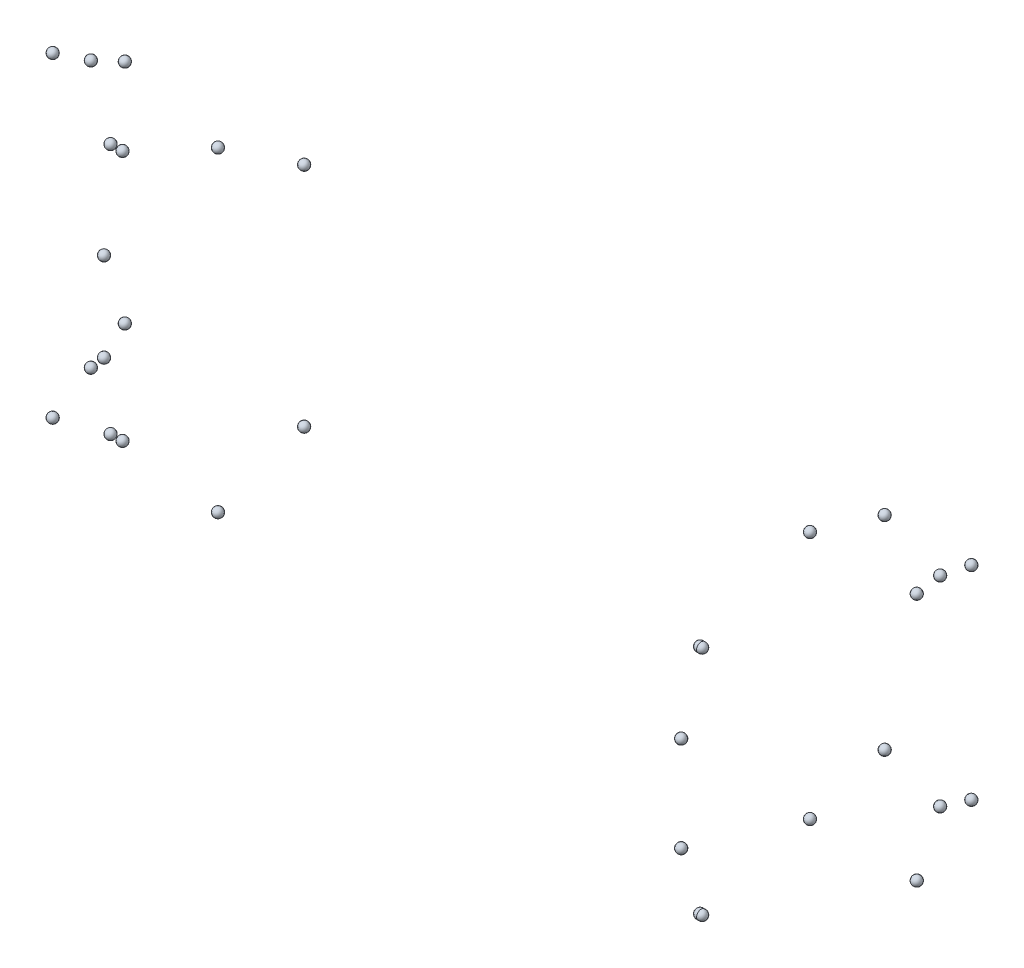
ISO-10303-21;
HEADER;
FILE_DESCRIPTION(('STEP AP214'),'2;1');
FILE_NAME('part.step','',(''),(''),'','','');
FILE_SCHEMA(('AUTOMOTIVE_DESIGN { 1 0 10303 214 1 1 1 1 }'));
ENDSEC;
DATA;
#1=APPLICATION_CONTEXT('core data for automotive mechanical design processes');
#2=APPLICATION_PROTOCOL_DEFINITION('international standard','automotive_design',2000,#1);
#3=PRODUCT_CONTEXT('',#1,'mechanical');
#4=PRODUCT('Part','Part','',(#3));
#5=PRODUCT_RELATED_PRODUCT_CATEGORY('part','',(#4));
#6=PRODUCT_DEFINITION_FORMATION('','',#4);
#7=PRODUCT_DEFINITION_CONTEXT('part definition',#1,'design');
#8=PRODUCT_DEFINITION('design','',#6,#7);
#9=PRODUCT_DEFINITION_SHAPE('','',#8);
#10=(LENGTH_UNIT() NAMED_UNIT(*) SI_UNIT(.MILLI.,.METRE.));
#11=(NAMED_UNIT(*) PLANE_ANGLE_UNIT() SI_UNIT($,.RADIAN.));
#12=(NAMED_UNIT(*) SI_UNIT($,.STERADIAN.) SOLID_ANGLE_UNIT());
#13=UNCERTAINTY_MEASURE_WITH_UNIT(LENGTH_MEASURE(1.E-05),#10,'distance_accuracy_value','');
#14=(GEOMETRIC_REPRESENTATION_CONTEXT(3) GLOBAL_UNCERTAINTY_ASSIGNED_CONTEXT((#13)) GLOBAL_UNIT_ASSIGNED_CONTEXT((#10,
#11,#12)) REPRESENTATION_CONTEXT('',''));
#15=CARTESIAN_POINT('',(0.,0.,0.));
#16=DIRECTION('',(0.,0.,1.));
#17=DIRECTION('',(1.,0.,0.));
#18=AXIS2_PLACEMENT_3D('',#15,#16,#17);
#19=CARTESIAN_POINT('',(3.83885720915255,100.814094182891,618.081416146198));
#20=DIRECTION('',(0.,-1.,0.));
#21=DIRECTION('',(-1.,0.,0.));
#22=AXIS2_PLACEMENT_3D('',#19,#20,#21);
#23=SPHERICAL_SURFACE('',#22,10.);
#24=CARTESIAN_POINT('',(3.83885720915255,90.814094182891,618.081416146198));
#25=VERTEX_POINT('',#24);
#26=VERTEX_LOOP('',#25);
#27=FACE_BOUND('',#26,.T.);
#28=ADVANCED_FACE('P0_F13',(#27),#23,.T.);
#29=CLOSED_SHELL('',(#28));
#30=MANIFOLD_SOLID_BREP('P0_B1',#29);
#31=CARTESIAN_POINT('',(-1504.87722611713,94.0930005745882,335.429980441855));
#32=DIRECTION('',(0.,-1.,0.));
#33=DIRECTION('',(-1.,0.,0.));
#34=AXIS2_PLACEMENT_3D('',#31,#32,#33);
#35=SPHERICAL_SURFACE('',#34,10.);
#36=CARTESIAN_POINT('',(-1504.87722611713,84.0930005745882,335.429980441855));
#37=VERTEX_POINT('',#36);
#38=VERTEX_LOOP('',#37);
#39=FACE_BOUND('',#38,.T.);
#40=ADVANCED_FACE('P1_F13',(#39),#35,.T.);
#41=CLOSED_SHELL('',(#40));
#42=MANIFOLD_SOLID_BREP('P1_B1',#41);
#43=CARTESIAN_POINT('',(3.83885720915255,-100.814094182891,618.081416146198));
#44=DIRECTION('',(0.,-1.,0.));
#45=DIRECTION('',(-1.,0.,0.));
#46=AXIS2_PLACEMENT_3D('',#43,#44,#45);
#47=SPHERICAL_SURFACE('',#46,10.);
#48=CARTESIAN_POINT('',(3.83885720915255,-110.814094182891,618.081416146198));
#49=VERTEX_POINT('',#48);
#50=VERTEX_LOOP('',#49);
#51=FACE_BOUND('',#50,.T.);
#52=ADVANCED_FACE('P2_F13',(#51),#47,.T.);
#53=CLOSED_SHELL('',(#52));
#54=MANIFOLD_SOLID_BREP('P2_B1',#53);
#55=CARTESIAN_POINT('',(-1504.87722611713,-94.0930005745882,335.429980441855));
#56=DIRECTION('',(0.,-1.,0.));
#57=DIRECTION('',(-1.,0.,0.));
#58=AXIS2_PLACEMENT_3D('',#55,#56,#57);
#59=SPHERICAL_SURFACE('',#58,10.);
#60=CARTESIAN_POINT('',(-1504.87722611713,-104.093000574588,335.429980441855));
#61=VERTEX_POINT('',#60);
#62=VERTEX_LOOP('',#61);
#63=FACE_BOUND('',#62,.T.);
#64=ADVANCED_FACE('P3_F13',(#63),#59,.T.);
#65=CLOSED_SHELL('',(#64));
#66=MANIFOLD_SOLID_BREP('P3_B1',#65);
#67=CARTESIAN_POINT('',(-76.2,215.89999936,105.8672));
#68=DIRECTION('',(0.,-1.,0.));
#69=DIRECTION('',(-1.,0.,0.));
#70=AXIS2_PLACEMENT_3D('',#67,#68,#69);
#71=SPHERICAL_SURFACE('',#70,10.);
#72=CARTESIAN_POINT('',(-76.2,205.89999936,105.8672));
#73=VERTEX_POINT('',#72);
#74=VERTEX_LOOP('',#73);
#75=FACE_BOUND('',#74,.T.);
#76=ADVANCED_FACE('P4_F13',(#75),#71,.T.);
#77=CLOSED_SHELL('',(#76));
#78=MANIFOLD_SOLID_BREP('P4_B1',#77);
#79=CARTESIAN_POINT('',(-1692.39896034035,240.901803153981,103.647283415333));
#80=DIRECTION('',(0.,-1.,0.));
#81=DIRECTION('',(-1.,0.,0.));
#82=AXIS2_PLACEMENT_3D('',#79,#80,#81);
#83=SPHERICAL_SURFACE('',#82,10.);
#84=CARTESIAN_POINT('',(-1692.39896034035,230.901803153981,103.647283415333));
#85=VERTEX_POINT('',#84);
#86=VERTEX_LOOP('',#85);
#87=FACE_BOUND('',#86,.T.);
#88=ADVANCED_FACE('P5_F13',(#87),#83,.T.);
#89=CLOSED_SHELL('',(#88));
#90=MANIFOLD_SOLID_BREP('P5_B1',#89);
#91=CARTESIAN_POINT('',(-76.2,-215.89999936,105.8672));
#92=DIRECTION('',(0.,-1.,0.));
#93=DIRECTION('',(-1.,0.,0.));
#94=AXIS2_PLACEMENT_3D('',#91,#92,#93);
#95=SPHERICAL_SURFACE('',#94,10.);
#96=CARTESIAN_POINT('',(-76.2,-225.89999936,105.8672));
#97=VERTEX_POINT('',#96);
#98=VERTEX_LOOP('',#97);
#99=FACE_BOUND('',#98,.T.);
#100=ADVANCED_FACE('P6_F13',(#99),#95,.T.);
#101=CLOSED_SHELL('',(#100));
#102=MANIFOLD_SOLID_BREP('P6_B1',#101);
#103=CARTESIAN_POINT('',(-1692.39896034035,-240.901803153981,103.647283415333));
#104=DIRECTION('',(0.,-1.,0.));
#105=DIRECTION('',(-1.,0.,0.));
#106=AXIS2_PLACEMENT_3D('',#103,#104,#105);
#107=SPHERICAL_SURFACE('',#106,10.);
#108=CARTESIAN_POINT('',(-1692.39896034035,-250.901803153981,103.647283415333));
#109=VERTEX_POINT('',#108);
#110=VERTEX_LOOP('',#109);
#111=FACE_BOUND('',#110,.T.);
#112=ADVANCED_FACE('P7_F13',(#111),#107,.T.);
#113=CLOSED_SHELL('',(#112));
#114=MANIFOLD_SOLID_BREP('P7_B1',#113);
#115=CARTESIAN_POINT('',(107.95,215.89999936,105.8672));
#116=DIRECTION('',(0.,-1.,0.));
#117=DIRECTION('',(-1.,0.,0.));
#118=AXIS2_PLACEMENT_3D('',#115,#116,#117);
#119=SPHERICAL_SURFACE('',#118,10.);
#120=CARTESIAN_POINT('',(107.95,205.89999936,105.8672));
#121=VERTEX_POINT('',#120);
#122=VERTEX_LOOP('',#121);
#123=FACE_BOUND('',#122,.T.);
#124=ADVANCED_FACE('P8_F13',(#123),#119,.T.);
#125=CLOSED_SHELL('',(#124));
#126=MANIFOLD_SOLID_BREP('P8_B1',#125);
#127=CARTESIAN_POINT('',(-1312.200893076,240.901534160613,102.9881041092));
#128=DIRECTION('',(0.,-1.,0.));
#129=DIRECTION('',(-1.,0.,0.));
#130=AXIS2_PLACEMENT_3D('',#127,#128,#129);
#131=SPHERICAL_SURFACE('',#130,10.);
#132=CARTESIAN_POINT('',(-1312.200893076,230.901534160613,102.9881041092));
#133=VERTEX_POINT('',#132);
#134=VERTEX_LOOP('',#133);
#135=FACE_BOUND('',#134,.T.);
#136=ADVANCED_FACE('P9_F13',(#135),#131,.T.);
#137=CLOSED_SHELL('',(#136));
#138=MANIFOLD_SOLID_BREP('P9_B1',#137);
#139=CARTESIAN_POINT('',(107.95,-215.89999936,105.8672));
#140=DIRECTION('',(0.,-1.,0.));
#141=DIRECTION('',(-1.,0.,0.));
#142=AXIS2_PLACEMENT_3D('',#139,#140,#141);
#143=SPHERICAL_SURFACE('',#142,10.);
#144=CARTESIAN_POINT('',(107.95,-225.89999936,105.8672));
#145=VERTEX_POINT('',#144);
#146=VERTEX_LOOP('',#145);
#147=FACE_BOUND('',#146,.T.);
#148=ADVANCED_FACE('P10_F13',(#147),#143,.T.);
#149=CLOSED_SHELL('',(#148));
#150=MANIFOLD_SOLID_BREP('P10_B1',#149);
#151=CARTESIAN_POINT('',(-1312.200893076,-240.901534160613,102.9881041092));
#152=DIRECTION('',(0.,-1.,0.));
#153=DIRECTION('',(-1.,0.,0.));
#154=AXIS2_PLACEMENT_3D('',#151,#152,#153);
#155=SPHERICAL_SURFACE('',#154,10.);
#156=CARTESIAN_POINT('',(-1312.200893076,-250.901534160613,102.9881041092));
#157=VERTEX_POINT('',#156);
#158=VERTEX_LOOP('',#157);
#159=FACE_BOUND('',#158,.T.);
#160=ADVANCED_FACE('P11_F13',(#159),#155,.T.);
#161=CLOSED_SHELL('',(#160));
#162=MANIFOLD_SOLID_BREP('P11_B1',#161);
#163=CARTESIAN_POINT('',(-0.477754296915482,245.919333217058,573.587119892319));
#164=DIRECTION('',(0.,-1.,0.));
#165=DIRECTION('',(-1.,0.,0.));
#166=AXIS2_PLACEMENT_3D('',#163,#164,#165);
#167=SPHERICAL_SURFACE('',#166,10.);
#168=CARTESIAN_POINT('',(-0.477754296915482,235.919333217058,573.587119892319));
#169=VERTEX_POINT('',#168);
#170=VERTEX_LOOP('',#169);
#171=FACE_BOUND('',#170,.T.);
#172=ADVANCED_FACE('P12_F13',(#171),#167,.T.);
#173=CLOSED_SHELL('',(#172));
#174=MANIFOLD_SOLID_BREP('P12_B1',#173);
#175=CARTESIAN_POINT('',(-1530.,266.7,296.37201348));
#176=DIRECTION('',(0.,-1.,0.));
#177=DIRECTION('',(-1.,0.,0.));
#178=AXIS2_PLACEMENT_3D('',#175,#176,#177);
#179=SPHERICAL_SURFACE('',#178,10.);
#180=CARTESIAN_POINT('',(-1530.,256.7,296.37201348));
#181=VERTEX_POINT('',#180);
#182=VERTEX_LOOP('',#181);
#183=FACE_BOUND('',#182,.T.);
#184=ADVANCED_FACE('P13_F13',(#183),#179,.T.);
#185=CLOSED_SHELL('',(#184));
#186=MANIFOLD_SOLID_BREP('P13_B1',#185);
#187=CARTESIAN_POINT('',(-0.477754296915482,-245.919333217058,573.587119892319));
#188=DIRECTION('',(0.,-1.,0.));
#189=DIRECTION('',(-1.,0.,0.));
#190=AXIS2_PLACEMENT_3D('',#187,#188,#189);
#191=SPHERICAL_SURFACE('',#190,10.);
#192=CARTESIAN_POINT('',(-0.477754296915482,-255.919333217058,573.587119892319));
#193=VERTEX_POINT('',#192);
#194=VERTEX_LOOP('',#193);
#195=FACE_BOUND('',#194,.T.);
#196=ADVANCED_FACE('P14_F12',(#195),#191,.T.);
#197=CLOSED_SHELL('',(#196));
#198=MANIFOLD_SOLID_BREP('P14_B1',#197);
#199=CARTESIAN_POINT('',(-1530.,-266.7,296.37201348));
#200=DIRECTION('',(0.,-1.,0.));
#201=DIRECTION('',(-1.,0.,0.));
#202=AXIS2_PLACEMENT_3D('',#199,#200,#201);
#203=SPHERICAL_SURFACE('',#202,10.);
#204=CARTESIAN_POINT('',(-1530.,-276.7,296.37201348));
#205=VERTEX_POINT('',#204);
#206=VERTEX_LOOP('',#205);
#207=FACE_BOUND('',#206,.T.);
#208=ADVANCED_FACE('P15_F13',(#207),#203,.T.);
#209=CLOSED_SHELL('',(#208));
#210=MANIFOLD_SOLID_BREP('P15_B1',#209);
#211=CARTESIAN_POINT('',(3.83750331595061,245.919315144572,573.587150363068));
#212=DIRECTION('',(0.,-1.,0.));
#213=DIRECTION('',(-1.,0.,0.));
#214=AXIS2_PLACEMENT_3D('',#211,#212,#213);
#215=SPHERICAL_SURFACE('',#214,10.);
#216=CARTESIAN_POINT('',(3.83750331595061,235.919315144572,573.587150363068));
#217=VERTEX_POINT('',#216);
#218=VERTEX_LOOP('',#217);
#219=FACE_BOUND('',#218,.T.);
#220=ADVANCED_FACE('P16_F13',(#219),#215,.T.);
#221=CLOSED_SHELL('',(#220));
#222=MANIFOLD_SOLID_BREP('P16_B1',#221);
#223=CARTESIAN_POINT('',(-1504.6,266.7,296.37201348));
#224=DIRECTION('',(0.,-1.,0.));
#225=DIRECTION('',(-1.,0.,0.));
#226=AXIS2_PLACEMENT_3D('',#223,#224,#225);
#227=SPHERICAL_SURFACE('',#226,10.);
#228=CARTESIAN_POINT('',(-1504.6,256.7,296.37201348));
#229=VERTEX_POINT('',#228);
#230=VERTEX_LOOP('',#229);
#231=FACE_BOUND('',#230,.T.);
#232=ADVANCED_FACE('P17_F13',(#231),#227,.T.);
#233=CLOSED_SHELL('',(#232));
#234=MANIFOLD_SOLID_BREP('P17_B1',#233);
#235=CARTESIAN_POINT('',(3.83750331595061,-245.919315144572,573.587150363068));
#236=DIRECTION('',(0.,-1.,0.));
#237=DIRECTION('',(-1.,0.,0.));
#238=AXIS2_PLACEMENT_3D('',#235,#236,#237);
#239=SPHERICAL_SURFACE('',#238,10.);
#240=CARTESIAN_POINT('',(3.83750331595061,-255.919315144572,573.587150363068));
#241=VERTEX_POINT('',#240);
#242=VERTEX_LOOP('',#241);
#243=FACE_BOUND('',#242,.T.);
#244=ADVANCED_FACE('P18_F13',(#243),#239,.T.);
#245=CLOSED_SHELL('',(#244));
#246=MANIFOLD_SOLID_BREP('P18_B1',#245);
#247=CARTESIAN_POINT('',(-1504.6,-266.7,296.37201348));
#248=DIRECTION('',(0.,-1.,0.));
#249=DIRECTION('',(-1.,0.,0.));
#250=AXIS2_PLACEMENT_3D('',#247,#248,#249);
#251=SPHERICAL_SURFACE('',#250,10.);
#252=CARTESIAN_POINT('',(-1504.6,-276.7,296.37201348));
#253=VERTEX_POINT('',#252);
#254=VERTEX_LOOP('',#253);
#255=FACE_BOUND('',#254,.T.);
#256=ADVANCED_FACE('P19_F13',(#255),#251,.T.);
#257=CLOSED_SHELL('',(#256));
#258=MANIFOLD_SOLID_BREP('P19_B1',#257);
#259=CARTESIAN_POINT('',(90.4250861830988,212.407374129251,154.61056268451));
#260=DIRECTION('',(0.,-1.,0.));
#261=DIRECTION('',(-1.,0.,0.));
#262=AXIS2_PLACEMENT_3D('',#259,#260,#261);
#263=SPHERICAL_SURFACE('',#262,10.);
#264=CARTESIAN_POINT('',(90.4250861830988,202.407374129251,154.61056268451));
#265=VERTEX_POINT('',#264);
#266=VERTEX_LOOP('',#265);
#267=FACE_BOUND('',#266,.T.);
#268=ADVANCED_FACE('P20_F13',(#267),#263,.T.);
#269=CLOSED_SHELL('',(#268));
#270=MANIFOLD_SOLID_BREP('P20_B1',#269);
#271=CARTESIAN_POINT('',(-1688.81249317648,282.623084720324,179.342436261494));
#272=DIRECTION('',(0.,-1.,0.));
#273=DIRECTION('',(-1.,0.,0.));
#274=AXIS2_PLACEMENT_3D('',#271,#272,#273);
#275=SPHERICAL_SURFACE('',#274,10.);
#276=CARTESIAN_POINT('',(-1688.81249317648,272.623084720324,179.342436261494));
#277=VERTEX_POINT('',#276);
#278=VERTEX_LOOP('',#277);
#279=FACE_BOUND('',#278,.T.);
#280=ADVANCED_FACE('P21_F13',(#279),#275,.T.);
#281=CLOSED_SHELL('',(#280));
#282=MANIFOLD_SOLID_BREP('P21_B1',#281);
#283=CARTESIAN_POINT('',(90.4250861830988,-212.407374129251,154.61056268451));
#284=DIRECTION('',(0.,-1.,0.));
#285=DIRECTION('',(-1.,0.,0.));
#286=AXIS2_PLACEMENT_3D('',#283,#284,#285);
#287=SPHERICAL_SURFACE('',#286,10.);
#288=CARTESIAN_POINT('',(90.4250861830988,-222.407374129251,154.61056268451));
#289=VERTEX_POINT('',#288);
#290=VERTEX_LOOP('',#289);
#291=FACE_BOUND('',#290,.T.);
#292=ADVANCED_FACE('P22_F13',(#291),#287,.T.);
#293=CLOSED_SHELL('',(#292));
#294=MANIFOLD_SOLID_BREP('P22_B1',#293);
#295=CARTESIAN_POINT('',(-1688.81249317648,-282.623084720324,179.342436261494));
#296=DIRECTION('',(0.,-1.,0.));
#297=DIRECTION('',(-1.,0.,0.));
#298=AXIS2_PLACEMENT_3D('',#295,#296,#297);
#299=SPHERICAL_SURFACE('',#298,10.);
#300=CARTESIAN_POINT('',(-1688.81249317648,-292.623084720324,179.342436261494));
#301=VERTEX_POINT('',#300);
#302=VERTEX_LOOP('',#301);
#303=FACE_BOUND('',#302,.T.);
#304=ADVANCED_FACE('P23_F13',(#303),#299,.T.);
#305=CLOSED_SHELL('',(#304));
#306=MANIFOLD_SOLID_BREP('P23_B1',#305);
#307=CARTESIAN_POINT('',(-76.2001685761387,264.020269051221,264.454035910645));
#308=DIRECTION('',(0.,-1.,0.));
#309=DIRECTION('',(-1.,0.,0.));
#310=AXIS2_PLACEMENT_3D('',#307,#308,#309);
#311=SPHERICAL_SURFACE('',#310,10.);
#312=CARTESIAN_POINT('',(-76.2001685761387,254.020269051221,264.454035910645));
#313=VERTEX_POINT('',#312);
#314=VERTEX_LOOP('',#313);
#315=FACE_BOUND('',#314,.T.);
#316=ADVANCED_FACE('P24_F13',(#315),#311,.T.);
#317=CLOSED_SHELL('',(#316));
#318=MANIFOLD_SOLID_BREP('P24_B1',#317);
#319=CARTESIAN_POINT('',(-1690.30732427175,335.412623101088,259.039888378306));
#320=DIRECTION('',(0.,-1.,0.));
#321=DIRECTION('',(-1.,0.,0.));
#322=AXIS2_PLACEMENT_3D('',#319,#320,#321);
#323=SPHERICAL_SURFACE('',#322,10.);
#324=CARTESIAN_POINT('',(-1690.30732427175,325.412623101088,259.039888378306));
#325=VERTEX_POINT('',#324);
#326=VERTEX_LOOP('',#325);
#327=FACE_BOUND('',#326,.T.);
#328=ADVANCED_FACE('P25_F13',(#327),#323,.T.);
#329=CLOSED_SHELL('',(#328));
#330=MANIFOLD_SOLID_BREP('P25_B1',#329);
#331=CARTESIAN_POINT('',(-76.2001685761387,-264.020269051221,264.454035910645));
#332=DIRECTION('',(0.,-1.,0.));
#333=DIRECTION('',(-1.,0.,0.));
#334=AXIS2_PLACEMENT_3D('',#331,#332,#333);
#335=SPHERICAL_SURFACE('',#334,10.);
#336=CARTESIAN_POINT('',(-76.2001685761387,-274.020269051221,264.454035910645));
#337=VERTEX_POINT('',#336);
#338=VERTEX_LOOP('',#337);
#339=FACE_BOUND('',#338,.T.);
#340=ADVANCED_FACE('P26_F13',(#339),#335,.T.);
#341=CLOSED_SHELL('',(#340));
#342=MANIFOLD_SOLID_BREP('P26_B1',#341);
#343=CARTESIAN_POINT('',(-1690.30732427175,-335.412623101088,259.039888378306));
#344=DIRECTION('',(0.,-1.,0.));
#345=DIRECTION('',(-1.,0.,0.));
#346=AXIS2_PLACEMENT_3D('',#343,#344,#345);
#347=SPHERICAL_SURFACE('',#346,10.);
#348=CARTESIAN_POINT('',(-1690.30732427175,-345.412623101088,259.039888378306));
#349=VERTEX_POINT('',#348);
#350=VERTEX_LOOP('',#349);
#351=FACE_BOUND('',#350,.T.);
#352=ADVANCED_FACE('P27_F13',(#351),#347,.T.);
#353=CLOSED_SHELL('',(#352));
#354=MANIFOLD_SOLID_BREP('P27_B1',#353);
#355=CARTESIAN_POINT('',(150.600623436954,263.805493304172,264.411649120065));
#356=DIRECTION('',(0.,-1.,0.));
#357=DIRECTION('',(-1.,0.,0.));
#358=AXIS2_PLACEMENT_3D('',#355,#356,#357);
#359=SPHERICAL_SURFACE('',#358,10.);
#360=CARTESIAN_POINT('',(150.600623436954,253.805493304172,264.411649120065));
#361=VERTEX_POINT('',#360);
#362=VERTEX_LOOP('',#361);
#363=FACE_BOUND('',#362,.T.);
#364=ADVANCED_FACE('P28_F13',(#363),#359,.T.);
#365=CLOSED_SHELL('',(#364));
#366=MANIFOLD_SOLID_BREP('P28_B1',#365);
#367=CARTESIAN_POINT('',(-1340.81956382901,335.414839544494,257.365377564095));
#368=DIRECTION('',(0.,-1.,0.));
#369=DIRECTION('',(-1.,0.,0.));
#370=AXIS2_PLACEMENT_3D('',#367,#368,#369);
#371=SPHERICAL_SURFACE('',#370,10.);
#372=CARTESIAN_POINT('',(-1340.81956382901,325.414839544494,257.365377564095));
#373=VERTEX_POINT('',#372);
#374=VERTEX_LOOP('',#373);
#375=FACE_BOUND('',#374,.T.);
#376=ADVANCED_FACE('P29_F13',(#375),#371,.T.);
#377=CLOSED_SHELL('',(#376));
#378=MANIFOLD_SOLID_BREP('P29_B1',#377);
#379=CARTESIAN_POINT('',(150.600623436954,-263.805493304172,264.411649120065));
#380=DIRECTION('',(0.,-1.,0.));
#381=DIRECTION('',(-1.,0.,0.));
#382=AXIS2_PLACEMENT_3D('',#379,#380,#381);
#383=SPHERICAL_SURFACE('',#382,10.);
#384=CARTESIAN_POINT('',(150.600623436954,-273.805493304172,264.411649120065));
#385=VERTEX_POINT('',#384);
#386=VERTEX_LOOP('',#385);
#387=FACE_BOUND('',#386,.T.);
#388=ADVANCED_FACE('P30_F13',(#387),#383,.T.);
#389=CLOSED_SHELL('',(#388));
#390=MANIFOLD_SOLID_BREP('P30_B1',#389);
#391=CARTESIAN_POINT('',(-1340.81956382901,-335.414839544494,257.365377564095));
#392=DIRECTION('',(0.,-1.,0.));
#393=DIRECTION('',(-1.,0.,0.));
#394=AXIS2_PLACEMENT_3D('',#391,#392,#393);
#395=SPHERICAL_SURFACE('',#394,10.);
#396=CARTESIAN_POINT('',(-1340.81956382901,-345.414839544494,257.365377564095));
#397=VERTEX_POINT('',#396);
#398=VERTEX_LOOP('',#397);
#399=FACE_BOUND('',#398,.T.);
#400=ADVANCED_FACE('P31_F13',(#399),#395,.T.);
#401=CLOSED_SHELL('',(#400));
#402=MANIFOLD_SOLID_BREP('P31_B1',#401);
#403=ADVANCED_BREP_SHAPE_REPRESENTATION('',(#18,#30,#42,#54,#66,#78,#90,#102,#114,#126,#138,
#150,#162,#174,#186,#198,#210,#222,#234,#246,#258,#270,#282,#294,#306,#318,#330,#342,#354,#366,
#378,#390,#402),#14);
#404=SHAPE_DEFINITION_REPRESENTATION(#9,#403);
ENDSEC;
END-ISO-10303-21;
